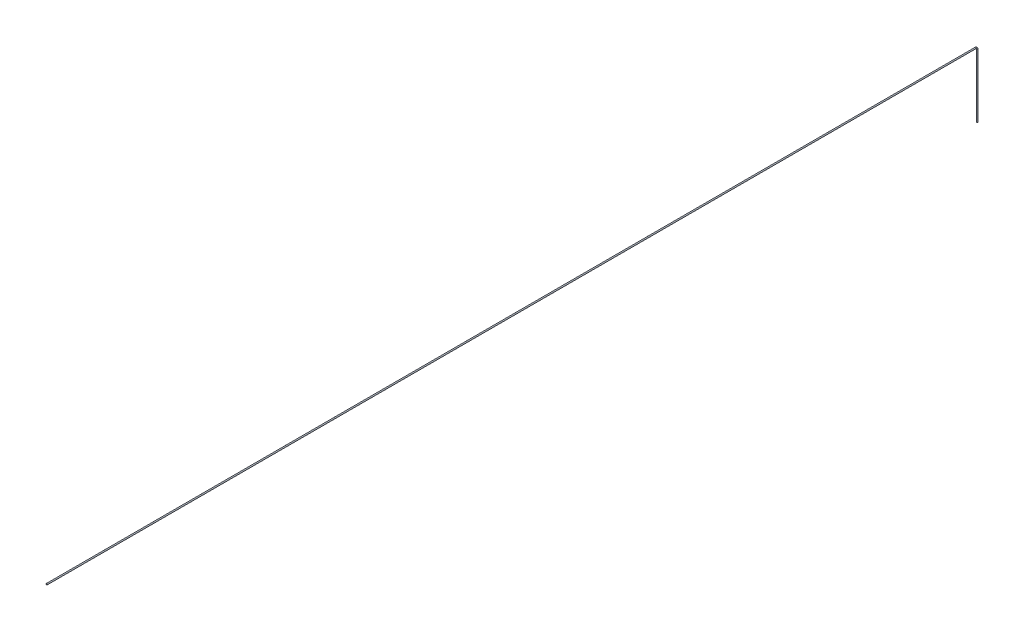
ISO-10303-21;
HEADER;
FILE_DESCRIPTION(('STEP AP214'),'2;1');
FILE_NAME('part.step','',(''),(''),'','','');
FILE_SCHEMA(('AUTOMOTIVE_DESIGN { 1 0 10303 214 1 1 1 1 }'));
ENDSEC;
DATA;
#1=APPLICATION_CONTEXT('core data for automotive mechanical design processes');
#2=APPLICATION_PROTOCOL_DEFINITION('international standard','automotive_design',2000,#1);
#3=PRODUCT_CONTEXT('',#1,'mechanical');
#4=PRODUCT('Part','Part','',(#3));
#5=PRODUCT_RELATED_PRODUCT_CATEGORY('part','',(#4));
#6=PRODUCT_DEFINITION_FORMATION('','',#4);
#7=PRODUCT_DEFINITION_CONTEXT('part definition',#1,'design');
#8=PRODUCT_DEFINITION('design','',#6,#7);
#9=PRODUCT_DEFINITION_SHAPE('','',#8);
#10=(LENGTH_UNIT() NAMED_UNIT(*) SI_UNIT(.MILLI.,.METRE.));
#11=(NAMED_UNIT(*) PLANE_ANGLE_UNIT() SI_UNIT($,.RADIAN.));
#12=(NAMED_UNIT(*) SI_UNIT($,.STERADIAN.) SOLID_ANGLE_UNIT());
#13=UNCERTAINTY_MEASURE_WITH_UNIT(LENGTH_MEASURE(1.E-05),#10,'distance_accuracy_value','');
#14=(GEOMETRIC_REPRESENTATION_CONTEXT(3) GLOBAL_UNCERTAINTY_ASSIGNED_CONTEXT((#13)) GLOBAL_UNIT_ASSIGNED_CONTEXT((#10,
#11,#12)) REPRESENTATION_CONTEXT('',''));
#15=CARTESIAN_POINT('',(0.,0.,0.));
#16=DIRECTION('',(0.,0.,1.));
#17=DIRECTION('',(1.,0.,0.));
#18=AXIS2_PLACEMENT_3D('',#15,#16,#17);
#19=CARTESIAN_POINT('',(0.,0.,0.));
#20=DIRECTION('',(0.,1.,0.));
#21=DIRECTION('',(0.,0.,1.));
#22=AXIS2_PLACEMENT_3D('',#19,#20,#21);
#23=CYLINDRICAL_SURFACE('',#22,54.);
#24=CARTESIAN_POINT('',(0.,5725.,0.));
#25=DIRECTION('',(0.,1.,0.));
#26=DIRECTION('',(0.,0.,1.));
#27=AXIS2_PLACEMENT_3D('',#24,#25,#26);
#28=CIRCLE('',#27,54.);
#29=CARTESIAN_POINT('',(0.,5725.,-54.0000000000002));
#30=VERTEX_POINT('',#29);
#31=EDGE_CURVE('E58',#30,#30,#28,.T.);
#32=ORIENTED_EDGE('',*,*,#31,.F.);
#33=EDGE_LOOP('',(#32));
#34=FACE_BOUND('',#33,.T.);
#35=CARTESIAN_POINT('',(0.,0.,0.));
#36=DIRECTION('',(0.,1.,0.));
#37=DIRECTION('',(0.,0.,1.));
#38=AXIS2_PLACEMENT_3D('',#35,#36,#37);
#39=CIRCLE('',#38,54.);
#40=CARTESIAN_POINT('',(0.,0.,54.));
#41=VERTEX_POINT('',#40);
#42=EDGE_CURVE('E59',#41,#41,#39,.T.);
#43=ORIENTED_EDGE('',*,*,#42,.T.);
#44=EDGE_LOOP('',(#43));
#45=FACE_BOUND('',#44,.T.);
#46=ADVANCED_FACE('F40',(#34,#45),#23,.T.);
#47=CARTESIAN_POINT('',(0.,5725.,150.));
#48=DIRECTION('',(1.,0.,0.));
#49=DIRECTION('',(0.,0.,-1.));
#50=AXIS2_PLACEMENT_3D('',#47,#48,#49);
#51=TOROIDAL_SURFACE('',#50,150.,54.);
#52=CARTESIAN_POINT('',(0.,5875.,150.000000000001));
#53=DIRECTION('',(0.,0.,1.));
#54=DIRECTION('',(0.,-1.,0.));
#55=AXIS2_PLACEMENT_3D('',#52,#53,#54);
#56=CIRCLE('',#55,54.);
#57=CARTESIAN_POINT('',(0.,5929.,150.000000000001));
#58=VERTEX_POINT('',#57);
#59=EDGE_CURVE('E41',#58,#58,#56,.T.);
#60=CARTESIAN_POINT('',(0.,5725.,150.));
#61=DIRECTION('',(1.,0.,0.));
#62=DIRECTION('',(0.,0.,-1.));
#63=AXIS2_PLACEMENT_3D('',#60,#61,#62);
#64=CIRCLE('',#63,204.);
#65=EDGE_CURVE('',#30,#58,#64,.T.);
#66=ORIENTED_EDGE('',*,*,#31,.T.);
#67=ORIENTED_EDGE('',*,*,#59,.F.);
#68=ORIENTED_EDGE('',*,*,#65,.T.);
#69=ORIENTED_EDGE('',*,*,#65,.F.);
#70=EDGE_LOOP('',(#66,#68,#67,#69));
#71=FACE_BOUND('',#70,.T.);
#72=ADVANCED_FACE('F66',(#71),#51,.T.);
#73=CARTESIAN_POINT('',(0.,5875.,150.000000000001));
#74=DIRECTION('',(0.,0.,1.));
#75=DIRECTION('',(0.,-1.,0.));
#76=AXIS2_PLACEMENT_3D('',#73,#74,#75);
#77=CYLINDRICAL_SURFACE('',#76,54.);
#78=CARTESIAN_POINT('',(0.,5874.99999999999,84125.));
#79=DIRECTION('',(0.,0.,1.));
#80=DIRECTION('',(0.,-1.,0.));
#81=AXIS2_PLACEMENT_3D('',#78,#79,#80);
#82=CIRCLE('',#81,54.);
#83=CARTESIAN_POINT('',(0.,5820.99999999999,84125.));
#84=VERTEX_POINT('',#83);
#85=EDGE_CURVE('E53',#84,#84,#82,.T.);
#86=ORIENTED_EDGE('',*,*,#85,.F.);
#87=EDGE_LOOP('',(#86));
#88=FACE_BOUND('',#87,.T.);
#89=ORIENTED_EDGE('',*,*,#59,.T.);
#90=EDGE_LOOP('',(#89));
#91=FACE_BOUND('',#90,.T.);
#92=ADVANCED_FACE('F39',(#88,#91),#77,.T.);
#93=CARTESIAN_POINT('',(0.,0.,0.));
#94=DIRECTION('',(0.,1.,0.));
#95=DIRECTION('',(0.,0.,1.));
#96=AXIS2_PLACEMENT_3D('',#93,#94,#95);
#97=PLANE('',#96);
#98=CARTESIAN_POINT('',(0.,0.,0.));
#99=DIRECTION('',(0.,1.,0.));
#100=DIRECTION('',(0.,0.,1.));
#101=AXIS2_PLACEMENT_3D('',#98,#99,#100);
#102=CIRCLE('',#101,50.);
#103=CARTESIAN_POINT('',(0.,0.,50.));
#104=VERTEX_POINT('',#103);
#105=EDGE_CURVE('E60',#104,#104,#102,.F.);
#106=ORIENTED_EDGE('',*,*,#105,.F.);
#107=EDGE_LOOP('',(#106));
#108=FACE_BOUND('',#107,.T.);
#109=ORIENTED_EDGE('',*,*,#42,.F.);
#110=EDGE_LOOP('',(#109));
#111=FACE_BOUND('',#110,.T.);
#112=ADVANCED_FACE('F73',(#108,#111),#97,.F.);
#113=CARTESIAN_POINT('',(0.,5874.99999999999,84125.));
#114=DIRECTION('',(0.,0.,1.));
#115=DIRECTION('',(0.,-1.,0.));
#116=AXIS2_PLACEMENT_3D('',#113,#114,#115);
#117=PLANE('',#116);
#118=CARTESIAN_POINT('',(0.,5874.99999999999,84125.));
#119=DIRECTION('',(0.,0.,1.));
#120=DIRECTION('',(0.,-1.,0.));
#121=AXIS2_PLACEMENT_3D('',#118,#119,#120);
#122=CIRCLE('',#121,50.);
#123=CARTESIAN_POINT('',(0.,5824.99999999999,84125.));
#124=VERTEX_POINT('',#123);
#125=EDGE_CURVE('E10',#124,#124,#122,.F.);
#126=ORIENTED_EDGE('',*,*,#125,.T.);
#127=EDGE_LOOP('',(#126));
#128=FACE_BOUND('',#127,.T.);
#129=ORIENTED_EDGE('',*,*,#85,.T.);
#130=EDGE_LOOP('',(#129));
#131=FACE_BOUND('',#130,.T.);
#132=ADVANCED_FACE('F95',(#128,#131),#117,.T.);
#133=CARTESIAN_POINT('',(0.,0.,0.));
#134=DIRECTION('',(0.,1.,0.));
#135=DIRECTION('',(0.,0.,1.));
#136=AXIS2_PLACEMENT_3D('',#133,#134,#135);
#137=CYLINDRICAL_SURFACE('',#136,50.);
#138=CARTESIAN_POINT('',(0.,5725.,0.));
#139=DIRECTION('',(0.,1.,0.));
#140=DIRECTION('',(0.,0.,1.));
#141=AXIS2_PLACEMENT_3D('',#138,#139,#140);
#142=CIRCLE('',#141,50.);
#143=CARTESIAN_POINT('',(0.,5725.,-50.0000000000002));
#144=VERTEX_POINT('',#143);
#145=EDGE_CURVE('E49',#144,#144,#142,.F.);
#146=ORIENTED_EDGE('',*,*,#145,.F.);
#147=EDGE_LOOP('',(#146));
#148=FACE_BOUND('',#147,.T.);
#149=ORIENTED_EDGE('',*,*,#105,.T.);
#150=EDGE_LOOP('',(#149));
#151=FACE_BOUND('',#150,.T.);
#152=ADVANCED_FACE('F86',(#148,#151),#137,.F.);
#153=CARTESIAN_POINT('',(0.,5725.,150.));
#154=DIRECTION('',(1.,0.,0.));
#155=DIRECTION('',(0.,0.,-1.));
#156=AXIS2_PLACEMENT_3D('',#153,#154,#155);
#157=TOROIDAL_SURFACE('',#156,150.,50.);
#158=CARTESIAN_POINT('',(0.,5875.,150.000000000001));
#159=DIRECTION('',(0.,0.,1.));
#160=DIRECTION('',(0.,-1.,0.));
#161=AXIS2_PLACEMENT_3D('',#158,#159,#160);
#162=CIRCLE('',#161,50.);
#163=CARTESIAN_POINT('',(0.,5925.,150.000000000001));
#164=VERTEX_POINT('',#163);
#165=EDGE_CURVE('E44',#164,#164,#162,.F.);
#166=CARTESIAN_POINT('',(0.,5725.,150.));
#167=DIRECTION('',(1.,0.,0.));
#168=DIRECTION('',(0.,0.,-1.));
#169=AXIS2_PLACEMENT_3D('',#166,#167,#168);
#170=CIRCLE('',#169,200.);
#171=EDGE_CURVE('',#144,#164,#170,.T.);
#172=ORIENTED_EDGE('',*,*,#145,.T.);
#173=ORIENTED_EDGE('',*,*,#165,.F.);
#174=ORIENTED_EDGE('',*,*,#171,.T.);
#175=ORIENTED_EDGE('',*,*,#171,.F.);
#176=EDGE_LOOP('',(#172,#174,#173,#175));
#177=FACE_BOUND('',#176,.T.);
#178=ADVANCED_FACE('F79',(#177),#157,.F.);
#179=CARTESIAN_POINT('',(0.,5875.,150.000000000001));
#180=DIRECTION('',(0.,0.,1.));
#181=DIRECTION('',(0.,-1.,0.));
#182=AXIS2_PLACEMENT_3D('',#179,#180,#181);
#183=CYLINDRICAL_SURFACE('',#182,50.);
#184=ORIENTED_EDGE('',*,*,#125,.F.);
#185=EDGE_LOOP('',(#184));
#186=FACE_BOUND('',#185,.T.);
#187=ORIENTED_EDGE('',*,*,#165,.T.);
#188=EDGE_LOOP('',(#187));
#189=FACE_BOUND('',#188,.T.);
#190=ADVANCED_FACE('F76',(#186,#189),#183,.F.);
#191=CLOSED_SHELL('',(#46,#72,#92,#112,#132,#152,#178,#190));
#192=MANIFOLD_SOLID_BREP('B2',#191);
#193=ADVANCED_BREP_SHAPE_REPRESENTATION('',(#18,#192),#14);
#194=SHAPE_DEFINITION_REPRESENTATION(#9,#193);
ENDSEC;
END-ISO-10303-21;
